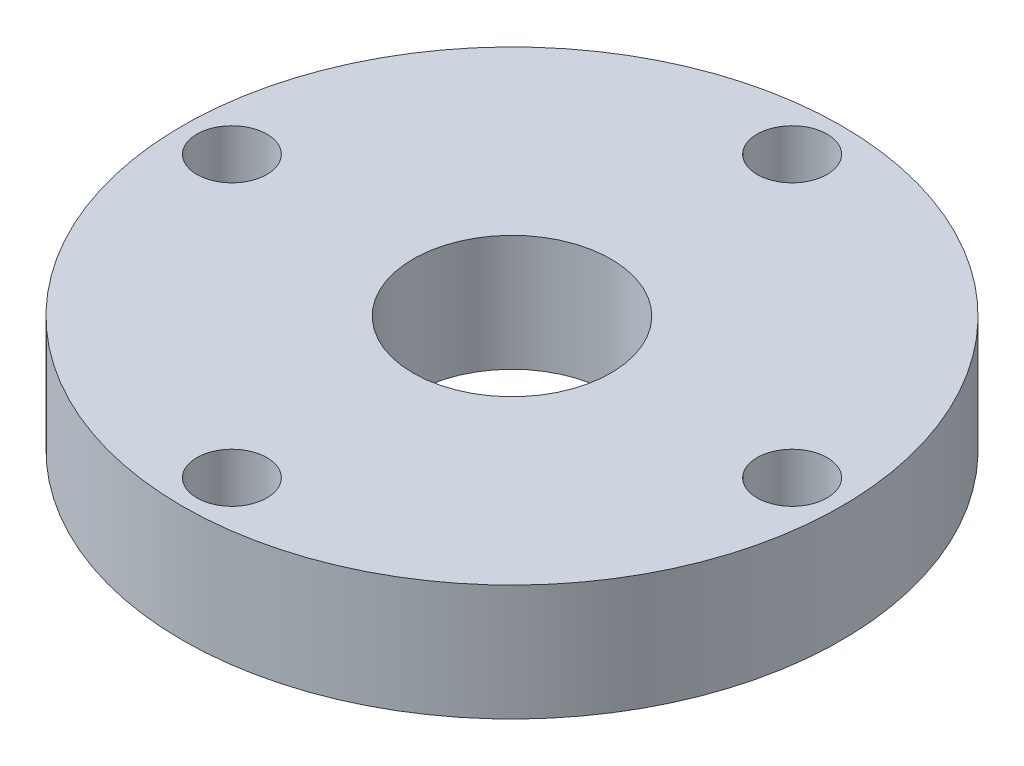
ISO-10303-21;
HEADER;
FILE_DESCRIPTION(('STEP AP214'),'2;1');
FILE_NAME('part.step','',(''),(''),'','','');
FILE_SCHEMA(('AUTOMOTIVE_DESIGN { 1 0 10303 214 1 1 1 1 }'));
ENDSEC;
DATA;
#1=APPLICATION_CONTEXT('core data for automotive mechanical design processes');
#2=APPLICATION_PROTOCOL_DEFINITION('international standard','automotive_design',2000,#1);
#3=PRODUCT_CONTEXT('',#1,'mechanical');
#4=PRODUCT('Part','Part','',(#3));
#5=PRODUCT_RELATED_PRODUCT_CATEGORY('part','',(#4));
#6=PRODUCT_DEFINITION_FORMATION('','',#4);
#7=PRODUCT_DEFINITION_CONTEXT('part definition',#1,'design');
#8=PRODUCT_DEFINITION('design','',#6,#7);
#9=PRODUCT_DEFINITION_SHAPE('','',#8);
#10=(LENGTH_UNIT() NAMED_UNIT(*) SI_UNIT(.MILLI.,.METRE.));
#11=(NAMED_UNIT(*) PLANE_ANGLE_UNIT() SI_UNIT($,.RADIAN.));
#12=(NAMED_UNIT(*) SI_UNIT($,.STERADIAN.) SOLID_ANGLE_UNIT());
#13=UNCERTAINTY_MEASURE_WITH_UNIT(LENGTH_MEASURE(1.E-05),#10,'distance_accuracy_value','');
#14=(GEOMETRIC_REPRESENTATION_CONTEXT(3) GLOBAL_UNCERTAINTY_ASSIGNED_CONTEXT((#13)) GLOBAL_UNIT_ASSIGNED_CONTEXT((#10,
#11,#12)) REPRESENTATION_CONTEXT('',''));
#15=CARTESIAN_POINT('',(0.,0.,0.));
#16=DIRECTION('',(0.,0.,1.));
#17=DIRECTION('',(1.,0.,0.));
#18=AXIS2_PLACEMENT_3D('',#15,#16,#17);
#19=CARTESIAN_POINT('',(0.,-11.176,0.));
#20=DIRECTION('',(0.,1.,0.));
#21=DIRECTION('',(0.,0.,1.));
#22=AXIS2_PLACEMENT_3D('',#19,#20,#21);
#23=PLANE('',#22);
#24=CARTESIAN_POINT('',(-53.975,-11.176,0.));
#25=DIRECTION('',(0.,1.,0.));
#26=DIRECTION('',(0.,0.,1.));
#27=AXIS2_PLACEMENT_3D('',#24,#25,#26);
#28=CIRCLE('',#27,4.36879999999999);
#29=CARTESIAN_POINT('',(-53.975,-11.176,4.36879999999999));
#30=VERTEX_POINT('',#29);
#31=EDGE_CURVE('E96',#30,#30,#28,.T.);
#32=ORIENTED_EDGE('',*,*,#31,.T.);
#33=EDGE_LOOP('',(#32));
#34=FACE_BOUND('',#33,.T.);
#35=CARTESIAN_POINT('',(0.,-11.176,53.975));
#36=DIRECTION('',(0.,1.,0.));
#37=DIRECTION('',(0.,0.,1.));
#38=AXIS2_PLACEMENT_3D('',#35,#36,#37);
#39=CIRCLE('',#38,4.36879999999999);
#40=CARTESIAN_POINT('',(0.,-11.176,58.3438));
#41=VERTEX_POINT('',#40);
#42=EDGE_CURVE('E84',#41,#41,#39,.T.);
#43=ORIENTED_EDGE('',*,*,#42,.T.);
#44=EDGE_LOOP('',(#43));
#45=FACE_BOUND('',#44,.T.);
#46=CARTESIAN_POINT('',(53.975,-11.176,0.));
#47=DIRECTION('',(0.,1.,0.));
#48=DIRECTION('',(0.,0.,1.));
#49=AXIS2_PLACEMENT_3D('',#46,#47,#48);
#50=CIRCLE('',#49,4.36879999999999);
#51=CARTESIAN_POINT('',(53.975,-11.176,4.36879999999999));
#52=VERTEX_POINT('',#51);
#53=EDGE_CURVE('E72',#52,#52,#50,.T.);
#54=ORIENTED_EDGE('',*,*,#53,.T.);
#55=EDGE_LOOP('',(#54));
#56=FACE_BOUND('',#55,.T.);
#57=CARTESIAN_POINT('',(0.,-11.176,-53.975));
#58=DIRECTION('',(0.,1.,0.));
#59=DIRECTION('',(0.,0.,1.));
#60=AXIS2_PLACEMENT_3D('',#57,#58,#59);
#61=CIRCLE('',#60,4.36879999999999);
#62=CARTESIAN_POINT('',(0.,-11.176,-49.6062));
#63=VERTEX_POINT('',#62);
#64=EDGE_CURVE('E59',#63,#63,#61,.T.);
#65=ORIENTED_EDGE('',*,*,#64,.T.);
#66=EDGE_LOOP('',(#65));
#67=FACE_BOUND('',#66,.T.);
#68=CARTESIAN_POINT('',(0.,-11.176,0.));
#69=DIRECTION('',(0.,1.,0.));
#70=DIRECTION('',(0.,0.,1.));
#71=AXIS2_PLACEMENT_3D('',#68,#69,#70);
#72=CIRCLE('',#71,19.05);
#73=CARTESIAN_POINT('',(0.,-11.176,19.05));
#74=VERTEX_POINT('',#73);
#75=EDGE_CURVE('E51',#74,#74,#72,.T.);
#76=ORIENTED_EDGE('',*,*,#75,.T.);
#77=EDGE_LOOP('',(#76));
#78=FACE_BOUND('',#77,.T.);
#79=CARTESIAN_POINT('',(0.,-11.176,0.));
#80=DIRECTION('',(0.,-1.,0.));
#81=DIRECTION('',(0.,0.,-1.));
#82=AXIS2_PLACEMENT_3D('',#79,#80,#81);
#83=CIRCLE('',#82,63.5);
#84=CARTESIAN_POINT('',(0.,-11.176,-63.5));
#85=VERTEX_POINT('',#84);
#86=EDGE_CURVE('E10',#85,#85,#83,.T.);
#87=ORIENTED_EDGE('',*,*,#86,.T.);
#88=EDGE_LOOP('',(#87));
#89=FACE_BOUND('',#88,.T.);
#90=ADVANCED_FACE('F41',(#34,#45,#56,#67,#78,#89),#23,.F.);
#91=CARTESIAN_POINT('',(0.,-36.576,0.));
#92=DIRECTION('',(0.,-1.,0.));
#93=DIRECTION('',(0.,0.,-1.));
#94=AXIS2_PLACEMENT_3D('',#91,#92,#93);
#95=CYLINDRICAL_SURFACE('',#94,63.5);
#96=ORIENTED_EDGE('',*,*,#86,.F.);
#97=EDGE_LOOP('',(#96));
#98=FACE_BOUND('',#97,.T.);
#99=CARTESIAN_POINT('',(0.,11.176,0.));
#100=DIRECTION('',(0.,-1.,0.));
#101=DIRECTION('',(0.,0.,-1.));
#102=AXIS2_PLACEMENT_3D('',#99,#100,#101);
#103=CIRCLE('',#102,63.5);
#104=CARTESIAN_POINT('',(0.,11.176,-63.5));
#105=VERTEX_POINT('',#104);
#106=EDGE_CURVE('E47',#105,#105,#103,.T.);
#107=ORIENTED_EDGE('',*,*,#106,.T.);
#108=EDGE_LOOP('',(#107));
#109=FACE_BOUND('',#108,.T.);
#110=ADVANCED_FACE('F115',(#98,#109),#95,.T.);
#111=CARTESIAN_POINT('',(-63.5,11.176,0.));
#112=DIRECTION('',(0.,-1.,0.));
#113=DIRECTION('',(0.,0.,-1.));
#114=AXIS2_PLACEMENT_3D('',#111,#112,#113);
#115=PLANE('',#114);
#116=CARTESIAN_POINT('',(-53.975,11.176,0.));
#117=DIRECTION('',(0.,1.,0.));
#118=DIRECTION('',(0.,0.,1.));
#119=AXIS2_PLACEMENT_3D('',#116,#117,#118);
#120=CIRCLE('',#119,6.74369999999999);
#121=CARTESIAN_POINT('',(-53.975,11.176,6.74369999999999));
#122=VERTEX_POINT('',#121);
#123=EDGE_CURVE('E105',#122,#122,#120,.T.);
#124=ORIENTED_EDGE('',*,*,#123,.F.);
#125=EDGE_LOOP('',(#124));
#126=FACE_BOUND('',#125,.T.);
#127=CARTESIAN_POINT('',(0.,11.176,53.975));
#128=DIRECTION('',(0.,1.,0.));
#129=DIRECTION('',(0.,0.,1.));
#130=AXIS2_PLACEMENT_3D('',#127,#128,#129);
#131=CIRCLE('',#130,6.7437);
#132=CARTESIAN_POINT('',(0.,11.176,60.7187));
#133=VERTEX_POINT('',#132);
#134=EDGE_CURVE('E93',#133,#133,#131,.T.);
#135=ORIENTED_EDGE('',*,*,#134,.F.);
#136=EDGE_LOOP('',(#135));
#137=FACE_BOUND('',#136,.T.);
#138=CARTESIAN_POINT('',(53.975,11.176,0.));
#139=DIRECTION('',(0.,1.,0.));
#140=DIRECTION('',(0.,0.,1.));
#141=AXIS2_PLACEMENT_3D('',#138,#139,#140);
#142=CIRCLE('',#141,6.74369999999999);
#143=CARTESIAN_POINT('',(53.975,11.176,6.74369999999999));
#144=VERTEX_POINT('',#143);
#145=EDGE_CURVE('E81',#144,#144,#142,.T.);
#146=ORIENTED_EDGE('',*,*,#145,.F.);
#147=EDGE_LOOP('',(#146));
#148=FACE_BOUND('',#147,.T.);
#149=CARTESIAN_POINT('',(0.,11.176,-53.975));
#150=DIRECTION('',(0.,1.,0.));
#151=DIRECTION('',(0.,0.,1.));
#152=AXIS2_PLACEMENT_3D('',#149,#150,#151);
#153=CIRCLE('',#152,6.7437);
#154=CARTESIAN_POINT('',(0.,11.176,-47.2313));
#155=VERTEX_POINT('',#154);
#156=EDGE_CURVE('E69',#155,#155,#153,.T.);
#157=ORIENTED_EDGE('',*,*,#156,.F.);
#158=EDGE_LOOP('',(#157));
#159=FACE_BOUND('',#158,.T.);
#160=CARTESIAN_POINT('',(0.,11.176,0.));
#161=DIRECTION('',(0.,1.,0.));
#162=DIRECTION('',(0.,0.,1.));
#163=AXIS2_PLACEMENT_3D('',#160,#161,#162);
#164=CIRCLE('',#163,19.05);
#165=CARTESIAN_POINT('',(0.,11.176,19.05));
#166=VERTEX_POINT('',#165);
#167=EDGE_CURVE('E55',#166,#166,#164,.T.);
#168=ORIENTED_EDGE('',*,*,#167,.F.);
#169=EDGE_LOOP('',(#168));
#170=FACE_BOUND('',#169,.T.);
#171=ORIENTED_EDGE('',*,*,#106,.F.);
#172=EDGE_LOOP('',(#171));
#173=FACE_BOUND('',#172,.T.);
#174=ADVANCED_FACE('F111',(#126,#137,#148,#159,#170,#173),#115,.F.);
#175=CARTESIAN_POINT('',(0.,-11.176,0.));
#176=DIRECTION('',(0.,1.,0.));
#177=DIRECTION('',(0.,0.,1.));
#178=AXIS2_PLACEMENT_3D('',#175,#176,#177);
#179=CYLINDRICAL_SURFACE('',#178,19.05);
#180=ORIENTED_EDGE('',*,*,#75,.F.);
#181=EDGE_LOOP('',(#180));
#182=FACE_BOUND('',#181,.T.);
#183=ORIENTED_EDGE('',*,*,#167,.T.);
#184=EDGE_LOOP('',(#183));
#185=FACE_BOUND('',#184,.T.);
#186=ADVANCED_FACE('F114',(#182,#185),#179,.F.);
#187=CARTESIAN_POINT('',(0.,11.176,-53.975));
#188=DIRECTION('',(0.,1.,0.));
#189=DIRECTION('',(0.,0.,1.));
#190=AXIS2_PLACEMENT_3D('',#187,#188,#189);
#191=CYLINDRICAL_SURFACE('',#190,4.36879999999999);
#192=ORIENTED_EDGE('',*,*,#64,.F.);
#193=EDGE_LOOP('',(#192));
#194=FACE_BOUND('',#193,.T.);
#195=CARTESIAN_POINT('',(0.,1.52400000000001,-53.975));
#196=DIRECTION('',(0.,1.,0.));
#197=DIRECTION('',(0.,0.,1.));
#198=AXIS2_PLACEMENT_3D('',#195,#196,#197);
#199=CIRCLE('',#198,4.36879999999999);
#200=CARTESIAN_POINT('',(0.,1.52400000000001,-49.6062));
#201=VERTEX_POINT('',#200);
#202=EDGE_CURVE('E63',#201,#201,#199,.T.);
#203=ORIENTED_EDGE('',*,*,#202,.T.);
#204=EDGE_LOOP('',(#203));
#205=FACE_BOUND('',#204,.T.);
#206=ADVANCED_FACE('F127',(#194,#205),#191,.F.);
#207=CARTESIAN_POINT('',(4.36879999999999,1.524,-53.975));
#208=DIRECTION('',(0.,-1.,0.));
#209=DIRECTION('',(0.,0.,-1.));
#210=AXIS2_PLACEMENT_3D('',#207,#208,#209);
#211=PLANE('',#210);
#212=ORIENTED_EDGE('',*,*,#202,.F.);
#213=EDGE_LOOP('',(#212));
#214=FACE_BOUND('',#213,.T.);
#215=CARTESIAN_POINT('',(0.,1.524,-53.975));
#216=DIRECTION('',(0.,1.,0.));
#217=DIRECTION('',(0.,0.,1.));
#218=AXIS2_PLACEMENT_3D('',#215,#216,#217);
#219=CIRCLE('',#218,6.7437);
#220=CARTESIAN_POINT('',(0.,1.524,-47.2313));
#221=VERTEX_POINT('',#220);
#222=EDGE_CURVE('E66',#221,#221,#219,.T.);
#223=ORIENTED_EDGE('',*,*,#222,.T.);
#224=EDGE_LOOP('',(#223));
#225=FACE_BOUND('',#224,.T.);
#226=ADVANCED_FACE('F135',(#214,#225),#211,.F.);
#227=CARTESIAN_POINT('',(0.,11.176,-53.975));
#228=DIRECTION('',(0.,1.,0.));
#229=DIRECTION('',(0.,0.,1.));
#230=AXIS2_PLACEMENT_3D('',#227,#228,#229);
#231=CYLINDRICAL_SURFACE('',#230,6.7437);
#232=ORIENTED_EDGE('',*,*,#222,.F.);
#233=EDGE_LOOP('',(#232));
#234=FACE_BOUND('',#233,.T.);
#235=ORIENTED_EDGE('',*,*,#156,.T.);
#236=EDGE_LOOP('',(#235));
#237=FACE_BOUND('',#236,.T.);
#238=ADVANCED_FACE('F156',(#234,#237),#231,.F.);
#239=CARTESIAN_POINT('',(53.975,11.176,0.));
#240=DIRECTION('',(0.,1.,0.));
#241=DIRECTION('',(0.,0.,1.));
#242=AXIS2_PLACEMENT_3D('',#239,#240,#241);
#243=CYLINDRICAL_SURFACE('',#242,4.36879999999999);
#244=ORIENTED_EDGE('',*,*,#53,.F.);
#245=EDGE_LOOP('',(#244));
#246=FACE_BOUND('',#245,.T.);
#247=CARTESIAN_POINT('',(53.975,1.52400000000001,0.));
#248=DIRECTION('',(0.,1.,0.));
#249=DIRECTION('',(0.,0.,1.));
#250=AXIS2_PLACEMENT_3D('',#247,#248,#249);
#251=CIRCLE('',#250,4.36879999999999);
#252=CARTESIAN_POINT('',(53.975,1.52400000000001,4.36879999999999));
#253=VERTEX_POINT('',#252);
#254=EDGE_CURVE('E75',#253,#253,#251,.T.);
#255=ORIENTED_EDGE('',*,*,#254,.T.);
#256=EDGE_LOOP('',(#255));
#257=FACE_BOUND('',#256,.T.);
#258=ADVANCED_FACE('F162',(#246,#257),#243,.F.);
#259=CARTESIAN_POINT('',(58.3438,1.524,0.));
#260=DIRECTION('',(0.,-1.,0.));
#261=DIRECTION('',(0.,0.,-1.));
#262=AXIS2_PLACEMENT_3D('',#259,#260,#261);
#263=PLANE('',#262);
#264=ORIENTED_EDGE('',*,*,#254,.F.);
#265=EDGE_LOOP('',(#264));
#266=FACE_BOUND('',#265,.T.);
#267=CARTESIAN_POINT('',(53.975,1.524,0.));
#268=DIRECTION('',(0.,1.,0.));
#269=DIRECTION('',(0.,0.,1.));
#270=AXIS2_PLACEMENT_3D('',#267,#268,#269);
#271=CIRCLE('',#270,6.74369999999999);
#272=CARTESIAN_POINT('',(53.975,1.524,6.74369999999999));
#273=VERTEX_POINT('',#272);
#274=EDGE_CURVE('E78',#273,#273,#271,.T.);
#275=ORIENTED_EDGE('',*,*,#274,.T.);
#276=EDGE_LOOP('',(#275));
#277=FACE_BOUND('',#276,.T.);
#278=ADVANCED_FACE('F167',(#266,#277),#263,.F.);
#279=CARTESIAN_POINT('',(53.975,11.176,0.));
#280=DIRECTION('',(0.,1.,0.));
#281=DIRECTION('',(0.,0.,1.));
#282=AXIS2_PLACEMENT_3D('',#279,#280,#281);
#283=CYLINDRICAL_SURFACE('',#282,6.74369999999999);
#284=ORIENTED_EDGE('',*,*,#274,.F.);
#285=EDGE_LOOP('',(#284));
#286=FACE_BOUND('',#285,.T.);
#287=ORIENTED_EDGE('',*,*,#145,.T.);
#288=EDGE_LOOP('',(#287));
#289=FACE_BOUND('',#288,.T.);
#290=ADVANCED_FACE('F173',(#286,#289),#283,.F.);
#291=CARTESIAN_POINT('',(0.,11.176,53.975));
#292=DIRECTION('',(0.,1.,0.));
#293=DIRECTION('',(0.,0.,1.));
#294=AXIS2_PLACEMENT_3D('',#291,#292,#293);
#295=CYLINDRICAL_SURFACE('',#294,4.36879999999999);
#296=ORIENTED_EDGE('',*,*,#42,.F.);
#297=EDGE_LOOP('',(#296));
#298=FACE_BOUND('',#297,.T.);
#299=CARTESIAN_POINT('',(0.,1.52400000000001,53.975));
#300=DIRECTION('',(0.,1.,0.));
#301=DIRECTION('',(0.,0.,1.));
#302=AXIS2_PLACEMENT_3D('',#299,#300,#301);
#303=CIRCLE('',#302,4.36879999999999);
#304=CARTESIAN_POINT('',(0.,1.52400000000001,58.3438));
#305=VERTEX_POINT('',#304);
#306=EDGE_CURVE('E87',#305,#305,#303,.T.);
#307=ORIENTED_EDGE('',*,*,#306,.T.);
#308=EDGE_LOOP('',(#307));
#309=FACE_BOUND('',#308,.T.);
#310=ADVANCED_FACE('F177',(#298,#309),#295,.F.);
#311=CARTESIAN_POINT('',(4.36879999999999,1.524,53.975));
#312=DIRECTION('',(0.,-1.,0.));
#313=DIRECTION('',(0.,0.,-1.));
#314=AXIS2_PLACEMENT_3D('',#311,#312,#313);
#315=PLANE('',#314);
#316=ORIENTED_EDGE('',*,*,#306,.F.);
#317=EDGE_LOOP('',(#316));
#318=FACE_BOUND('',#317,.T.);
#319=CARTESIAN_POINT('',(0.,1.524,53.975));
#320=DIRECTION('',(0.,1.,0.));
#321=DIRECTION('',(0.,0.,1.));
#322=AXIS2_PLACEMENT_3D('',#319,#320,#321);
#323=CIRCLE('',#322,6.7437);
#324=CARTESIAN_POINT('',(0.,1.524,60.7187));
#325=VERTEX_POINT('',#324);
#326=EDGE_CURVE('E90',#325,#325,#323,.T.);
#327=ORIENTED_EDGE('',*,*,#326,.T.);
#328=EDGE_LOOP('',(#327));
#329=FACE_BOUND('',#328,.T.);
#330=ADVANCED_FACE('F181',(#318,#329),#315,.F.);
#331=CARTESIAN_POINT('',(0.,11.176,53.975));
#332=DIRECTION('',(0.,1.,0.));
#333=DIRECTION('',(0.,0.,1.));
#334=AXIS2_PLACEMENT_3D('',#331,#332,#333);
#335=CYLINDRICAL_SURFACE('',#334,6.7437);
#336=ORIENTED_EDGE('',*,*,#326,.F.);
#337=EDGE_LOOP('',(#336));
#338=FACE_BOUND('',#337,.T.);
#339=ORIENTED_EDGE('',*,*,#134,.T.);
#340=EDGE_LOOP('',(#339));
#341=FACE_BOUND('',#340,.T.);
#342=ADVANCED_FACE('F185',(#338,#341),#335,.F.);
#343=CARTESIAN_POINT('',(-53.975,11.176,0.));
#344=DIRECTION('',(0.,1.,0.));
#345=DIRECTION('',(0.,0.,1.));
#346=AXIS2_PLACEMENT_3D('',#343,#344,#345);
#347=CYLINDRICAL_SURFACE('',#346,4.36879999999999);
#348=ORIENTED_EDGE('',*,*,#31,.F.);
#349=EDGE_LOOP('',(#348));
#350=FACE_BOUND('',#349,.T.);
#351=CARTESIAN_POINT('',(-53.975,1.52400000000001,0.));
#352=DIRECTION('',(0.,1.,0.));
#353=DIRECTION('',(0.,0.,1.));
#354=AXIS2_PLACEMENT_3D('',#351,#352,#353);
#355=CIRCLE('',#354,4.36879999999999);
#356=CARTESIAN_POINT('',(-53.975,1.52400000000001,4.36879999999999));
#357=VERTEX_POINT('',#356);
#358=EDGE_CURVE('E99',#357,#357,#355,.T.);
#359=ORIENTED_EDGE('',*,*,#358,.T.);
#360=EDGE_LOOP('',(#359));
#361=FACE_BOUND('',#360,.T.);
#362=ADVANCED_FACE('F189',(#350,#361),#347,.F.);
#363=CARTESIAN_POINT('',(-49.6062,1.524,0.));
#364=DIRECTION('',(0.,-1.,0.));
#365=DIRECTION('',(0.,0.,-1.));
#366=AXIS2_PLACEMENT_3D('',#363,#364,#365);
#367=PLANE('',#366);
#368=ORIENTED_EDGE('',*,*,#358,.F.);
#369=EDGE_LOOP('',(#368));
#370=FACE_BOUND('',#369,.T.);
#371=CARTESIAN_POINT('',(-53.975,1.524,0.));
#372=DIRECTION('',(0.,1.,0.));
#373=DIRECTION('',(0.,0.,1.));
#374=AXIS2_PLACEMENT_3D('',#371,#372,#373);
#375=CIRCLE('',#374,6.74369999999999);
#376=CARTESIAN_POINT('',(-53.975,1.524,6.74369999999999));
#377=VERTEX_POINT('',#376);
#378=EDGE_CURVE('E102',#377,#377,#375,.T.);
#379=ORIENTED_EDGE('',*,*,#378,.T.);
#380=EDGE_LOOP('',(#379));
#381=FACE_BOUND('',#380,.T.);
#382=ADVANCED_FACE('F193',(#370,#381),#367,.F.);
#383=CARTESIAN_POINT('',(-53.975,11.176,0.));
#384=DIRECTION('',(0.,1.,0.));
#385=DIRECTION('',(0.,0.,1.));
#386=AXIS2_PLACEMENT_3D('',#383,#384,#385);
#387=CYLINDRICAL_SURFACE('',#386,6.74369999999999);
#388=ORIENTED_EDGE('',*,*,#378,.F.);
#389=EDGE_LOOP('',(#388));
#390=FACE_BOUND('',#389,.T.);
#391=ORIENTED_EDGE('',*,*,#123,.T.);
#392=EDGE_LOOP('',(#391));
#393=FACE_BOUND('',#392,.T.);
#394=ADVANCED_FACE('F109',(#390,#393),#387,.F.);
#395=CLOSED_SHELL('',(#90,#110,#174,#186,#206,#226,#238,#258,#278,#290,#310,#330,#342,#362,#382,#394));
#396=MANIFOLD_SOLID_BREP('B2',#395);
#397=ADVANCED_BREP_SHAPE_REPRESENTATION('',(#18,#396),#14);
#398=SHAPE_DEFINITION_REPRESENTATION(#9,#397);
ENDSEC;
END-ISO-10303-21;
